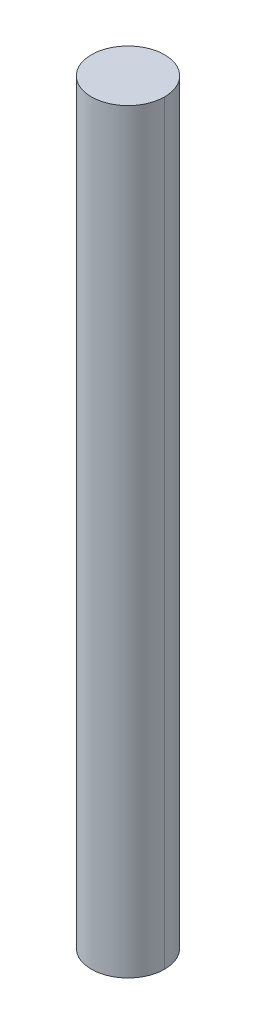
ISO-10303-21;
HEADER;
FILE_DESCRIPTION(('STEP AP214'),'2;1');
FILE_NAME('part.step','',(''),(''),'','','');
FILE_SCHEMA(('AUTOMOTIVE_DESIGN { 1 0 10303 214 1 1 1 1 }'));
ENDSEC;
DATA;
#1=APPLICATION_CONTEXT('core data for automotive mechanical design processes');
#2=APPLICATION_PROTOCOL_DEFINITION('international standard','automotive_design',2000,#1);
#3=PRODUCT_CONTEXT('',#1,'mechanical');
#4=PRODUCT('Part','Part','',(#3));
#5=PRODUCT_RELATED_PRODUCT_CATEGORY('part','',(#4));
#6=PRODUCT_DEFINITION_FORMATION('','',#4);
#7=PRODUCT_DEFINITION_CONTEXT('part definition',#1,'design');
#8=PRODUCT_DEFINITION('design','',#6,#7);
#9=PRODUCT_DEFINITION_SHAPE('','',#8);
#10=(LENGTH_UNIT() NAMED_UNIT(*) SI_UNIT(.MILLI.,.METRE.));
#11=(NAMED_UNIT(*) PLANE_ANGLE_UNIT() SI_UNIT($,.RADIAN.));
#12=(NAMED_UNIT(*) SI_UNIT($,.STERADIAN.) SOLID_ANGLE_UNIT());
#13=UNCERTAINTY_MEASURE_WITH_UNIT(LENGTH_MEASURE(1.E-05),#10,'distance_accuracy_value','');
#14=(GEOMETRIC_REPRESENTATION_CONTEXT(3) GLOBAL_UNCERTAINTY_ASSIGNED_CONTEXT((#13)) GLOBAL_UNIT_ASSIGNED_CONTEXT((#10,
#11,#12)) REPRESENTATION_CONTEXT('',''));
#15=CARTESIAN_POINT('',(0.,0.,0.));
#16=DIRECTION('',(0.,0.,1.));
#17=DIRECTION('',(1.,0.,0.));
#18=AXIS2_PLACEMENT_3D('',#15,#16,#17);
#19=CARTESIAN_POINT('',(-7.5,95.1973213818,0.));
#20=DIRECTION('',(0.,-1.,0.));
#21=DIRECTION('',(0.,0.,-1.));
#22=AXIS2_PLACEMENT_3D('',#19,#20,#21);
#23=PLANE('',#22);
#24=CARTESIAN_POINT('',(0.,95.1973213818,0.));
#25=DIRECTION('',(0.,-1.,0.));
#26=DIRECTION('',(1.,0.,0.));
#27=AXIS2_PLACEMENT_3D('',#24,#25,#26);
#28=CIRCLE('',#27,7.5);
#29=CARTESIAN_POINT('',(-7.5,95.1973213818,0.));
#30=VERTEX_POINT('',#29);
#31=CARTESIAN_POINT('',(7.5,95.1973213818,0.));
#32=VERTEX_POINT('',#31);
#33=EDGE_CURVE('E62',#30,#32,#28,.T.);
#34=ORIENTED_EDGE('',*,*,#33,.F.);
#35=CARTESIAN_POINT('',(0.,95.1973213818,0.));
#36=DIRECTION('',(0.,-1.,0.));
#37=DIRECTION('',(1.,0.,0.));
#38=AXIS2_PLACEMENT_3D('',#35,#36,#37);
#39=CIRCLE('',#38,7.5);
#40=EDGE_CURVE('E96',#32,#30,#39,.T.);
#41=ORIENTED_EDGE('',*,*,#40,.F.);
#42=EDGE_LOOP('',(#34,#41));
#43=FACE_BOUND('',#42,.T.);
#44=ADVANCED_FACE('F53',(#43),#23,.F.);
#45=CARTESIAN_POINT('',(-7.5,-59.8026786182,0.));
#46=DIRECTION('',(0.,-1.,0.));
#47=DIRECTION('',(0.,0.,-1.));
#48=AXIS2_PLACEMENT_3D('',#45,#46,#47);
#49=PLANE('',#48);
#50=CARTESIAN_POINT('',(0.,-59.8026786182,0.));
#51=DIRECTION('',(0.,-1.,0.));
#52=DIRECTION('',(1.,0.,0.));
#53=AXIS2_PLACEMENT_3D('',#50,#51,#52);
#54=CIRCLE('',#53,7.5);
#55=CARTESIAN_POINT('',(7.5,-59.8026786182,0.));
#56=VERTEX_POINT('',#55);
#57=CARTESIAN_POINT('',(-7.5,-59.8026786182,0.));
#58=VERTEX_POINT('',#57);
#59=EDGE_CURVE('E97',#56,#58,#54,.T.);
#60=ORIENTED_EDGE('',*,*,#59,.T.);
#61=CARTESIAN_POINT('',(0.,-59.8026786182,0.));
#62=DIRECTION('',(0.,-1.,0.));
#63=DIRECTION('',(1.,0.,0.));
#64=AXIS2_PLACEMENT_3D('',#61,#62,#63);
#65=CIRCLE('',#64,7.5);
#66=EDGE_CURVE('E11',#58,#56,#65,.T.);
#67=ORIENTED_EDGE('',*,*,#66,.T.);
#68=EDGE_LOOP('',(#60,#67));
#69=FACE_BOUND('',#68,.T.);
#70=ADVANCED_FACE('F107',(#69),#49,.T.);
#71=CARTESIAN_POINT('',(0.,17.6973213818,0.));
#72=DIRECTION('',(0.,-1.,0.));
#73=DIRECTION('',(-1.,0.,0.));
#74=AXIS2_PLACEMENT_3D('',#71,#72,#73);
#75=CYLINDRICAL_SURFACE('',#74,7.5);
#76=ORIENTED_EDGE('',*,*,#33,.T.);
#77=DIRECTION('',(0.,1.,0.));
#78=VECTOR('',#77,1.);
#79=CARTESIAN_POINT('',(7.5,17.6973213818,0.));
#80=LINE('',#79,#78);
#81=EDGE_CURVE('E87',#56,#32,#80,.T.);
#82=ORIENTED_EDGE('',*,*,#81,.F.);
#83=ORIENTED_EDGE('',*,*,#66,.F.);
#84=DIRECTION('',(0.,1.,0.));
#85=VECTOR('',#84,1.);
#86=CARTESIAN_POINT('',(-7.5,17.6973213818,0.));
#87=LINE('',#86,#85);
#88=EDGE_CURVE('E90',#58,#30,#87,.T.);
#89=ORIENTED_EDGE('',*,*,#88,.T.);
#90=EDGE_LOOP('',(#76,#82,#83,#89));
#91=FACE_BOUND('',#90,.T.);
#92=ADVANCED_FACE('F86',(#91),#75,.T.);
#93=CARTESIAN_POINT('',(0.,17.6973213818,0.));
#94=DIRECTION('',(0.,-1.,0.));
#95=DIRECTION('',(1.,0.,0.));
#96=AXIS2_PLACEMENT_3D('',#93,#94,#95);
#97=CYLINDRICAL_SURFACE('',#96,7.5);
#98=ORIENTED_EDGE('',*,*,#40,.T.);
#99=ORIENTED_EDGE('',*,*,#88,.F.);
#100=ORIENTED_EDGE('',*,*,#59,.F.);
#101=ORIENTED_EDGE('',*,*,#81,.T.);
#102=EDGE_LOOP('',(#98,#99,#100,#101));
#103=FACE_BOUND('',#102,.T.);
#104=ADVANCED_FACE('F95',(#103),#97,.T.);
#105=CLOSED_SHELL('',(#44,#70,#92,#104));
#106=MANIFOLD_SOLID_BREP('B2',#105);
#107=ADVANCED_BREP_SHAPE_REPRESENTATION('',(#18,#106),#14);
#108=SHAPE_DEFINITION_REPRESENTATION(#9,#107);
ENDSEC;
END-ISO-10303-21;
